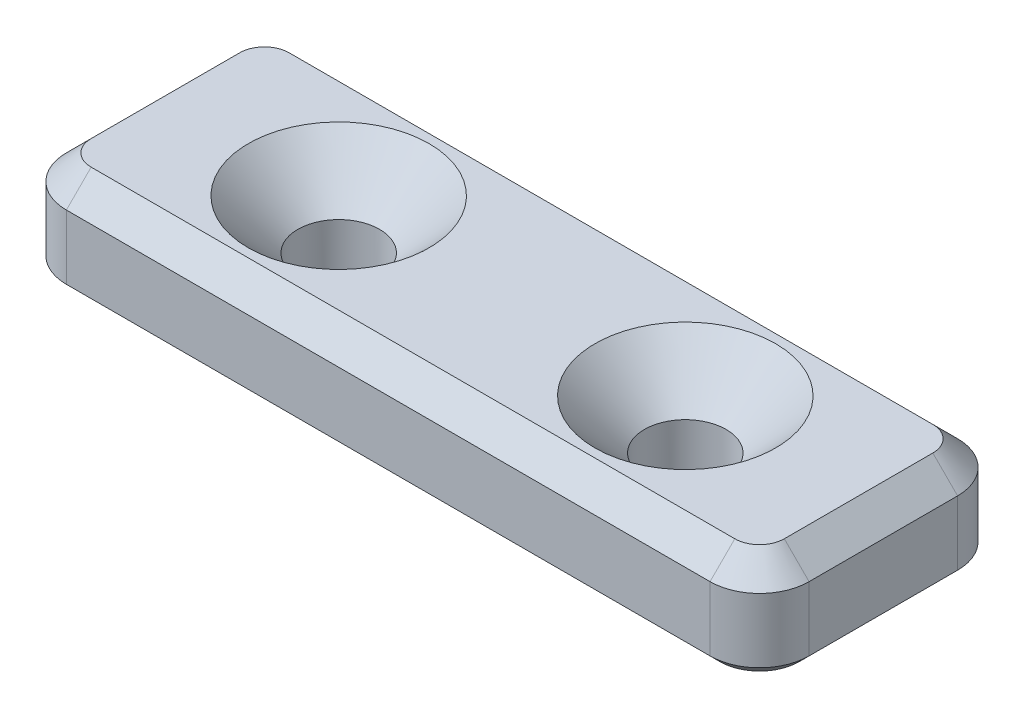
ISO-10303-21;
HEADER;
FILE_DESCRIPTION(('STEP AP214'),'2;1');
FILE_NAME('part.step','',(''),(''),'','','');
FILE_SCHEMA(('AUTOMOTIVE_DESIGN { 1 0 10303 214 1 1 1 1 }'));
ENDSEC;
DATA;
#1=APPLICATION_CONTEXT('core data for automotive mechanical design processes');
#2=APPLICATION_PROTOCOL_DEFINITION('international standard','automotive_design',2000,#1);
#3=PRODUCT_CONTEXT('',#1,'mechanical');
#4=PRODUCT('Part','Part','',(#3));
#5=PRODUCT_RELATED_PRODUCT_CATEGORY('part','',(#4));
#6=PRODUCT_DEFINITION_FORMATION('','',#4);
#7=PRODUCT_DEFINITION_CONTEXT('part definition',#1,'design');
#8=PRODUCT_DEFINITION('design','',#6,#7);
#9=PRODUCT_DEFINITION_SHAPE('','',#8);
#10=(LENGTH_UNIT() NAMED_UNIT(*) SI_UNIT(.MILLI.,.METRE.));
#11=(NAMED_UNIT(*) PLANE_ANGLE_UNIT() SI_UNIT($,.RADIAN.));
#12=(NAMED_UNIT(*) SI_UNIT($,.STERADIAN.) SOLID_ANGLE_UNIT());
#13=UNCERTAINTY_MEASURE_WITH_UNIT(LENGTH_MEASURE(1.E-05),#10,'distance_accuracy_value','');
#14=(GEOMETRIC_REPRESENTATION_CONTEXT(3) GLOBAL_UNCERTAINTY_ASSIGNED_CONTEXT((#13)) GLOBAL_UNIT_ASSIGNED_CONTEXT((#10,
#11,#12)) REPRESENTATION_CONTEXT('',''));
#15=CARTESIAN_POINT('',(0.,0.,0.));
#16=DIRECTION('',(0.,0.,1.));
#17=DIRECTION('',(1.,0.,0.));
#18=AXIS2_PLACEMENT_3D('',#15,#16,#17);
#19=CARTESIAN_POINT('',(0.,4.,0.));
#20=DIRECTION('',(1.,0.,0.));
#21=DIRECTION('',(0.,0.,-1.));
#22=AXIS2_PLACEMENT_3D('',#19,#20,#21);
#23=PLANE('',#22);
#24=DIRECTION('',(0.,-1.,0.));
#25=VECTOR('',#24,1.);
#26=CARTESIAN_POINT('',(0.,4.,-2.));
#27=LINE('',#26,#25);
#28=CARTESIAN_POINT('',(0.,0.399999999999994,-2.));
#29=VERTEX_POINT('',#28);
#30=CARTESIAN_POINT('',(0.,3.,-2.));
#31=VERTEX_POINT('',#30);
#32=EDGE_CURVE('E192',#29,#31,#27,.F.);
#33=ORIENTED_EDGE('',*,*,#32,.T.);
#34=DIRECTION('',(0.,0.,-1.));
#35=VECTOR('',#34,1.);
#36=CARTESIAN_POINT('',(0.,3.,0.));
#37=LINE('',#36,#35);
#38=CARTESIAN_POINT('',(0.,3.,-8.));
#39=VERTEX_POINT('',#38);
#40=EDGE_CURVE('E275',#31,#39,#37,.T.);
#41=ORIENTED_EDGE('',*,*,#40,.T.);
#42=DIRECTION('',(0.,-1.,0.));
#43=VECTOR('',#42,1.);
#44=CARTESIAN_POINT('',(0.,4.,-8.));
#45=LINE('',#44,#43);
#46=CARTESIAN_POINT('',(0.,0.399999999999994,-8.));
#47=VERTEX_POINT('',#46);
#48=EDGE_CURVE('E197',#39,#47,#45,.T.);
#49=ORIENTED_EDGE('',*,*,#48,.T.);
#50=DIRECTION('',(0.,0.,1.));
#51=VECTOR('',#50,1.);
#52=CARTESIAN_POINT('',(0.,0.399999999999994,-2.));
#53=LINE('',#52,#51);
#54=EDGE_CURVE('E223',#47,#29,#53,.T.);
#55=ORIENTED_EDGE('',*,*,#54,.T.);
#56=EDGE_LOOP('',(#33,#41,#49,#55));
#57=FACE_BOUND('',#56,.T.);
#58=ADVANCED_FACE('F43',(#57),#23,.F.);
#59=CARTESIAN_POINT('',(0.,4.,0.));
#60=DIRECTION('',(0.,0.,-1.));
#61=DIRECTION('',(-1.,0.,0.));
#62=AXIS2_PLACEMENT_3D('',#59,#60,#61);
#63=PLANE('',#62);
#64=DIRECTION('',(0.,-1.,0.));
#65=VECTOR('',#64,1.);
#66=CARTESIAN_POINT('',(28.,4.,0.));
#67=LINE('',#66,#65);
#68=CARTESIAN_POINT('',(28.,0.399999999999994,0.));
#69=VERTEX_POINT('',#68);
#70=CARTESIAN_POINT('',(28.,3.,0.));
#71=VERTEX_POINT('',#70);
#72=EDGE_CURVE('E186',#69,#71,#67,.F.);
#73=ORIENTED_EDGE('',*,*,#72,.T.);
#74=DIRECTION('',(-1.,0.,0.));
#75=VECTOR('',#74,1.);
#76=CARTESIAN_POINT('',(0.,3.,0.));
#77=LINE('',#76,#75);
#78=CARTESIAN_POINT('',(2.,3.,0.));
#79=VERTEX_POINT('',#78);
#80=EDGE_CURVE('E268',#71,#79,#77,.T.);
#81=ORIENTED_EDGE('',*,*,#80,.T.);
#82=DIRECTION('',(0.,-1.,0.));
#83=VECTOR('',#82,1.);
#84=CARTESIAN_POINT('',(2.,4.,0.));
#85=LINE('',#84,#83);
#86=CARTESIAN_POINT('',(2.,0.399999999999994,0.));
#87=VERTEX_POINT('',#86);
#88=EDGE_CURVE('E189',#79,#87,#85,.T.);
#89=ORIENTED_EDGE('',*,*,#88,.T.);
#90=DIRECTION('',(1.,0.,0.));
#91=VECTOR('',#90,1.);
#92=CARTESIAN_POINT('',(28.,0.399999999999994,0.));
#93=LINE('',#92,#91);
#94=EDGE_CURVE('E163',#87,#69,#93,.T.);
#95=ORIENTED_EDGE('',*,*,#94,.T.);
#96=EDGE_LOOP('',(#73,#81,#89,#95));
#97=FACE_BOUND('',#96,.T.);
#98=ADVANCED_FACE('F184',(#97),#63,.F.);
#99=CARTESIAN_POINT('',(30.,4.,0.));
#100=DIRECTION('',(-1.,0.,0.));
#101=DIRECTION('',(0.,0.,1.));
#102=AXIS2_PLACEMENT_3D('',#99,#100,#101);
#103=PLANE('',#102);
#104=DIRECTION('',(0.,-1.,0.));
#105=VECTOR('',#104,1.);
#106=CARTESIAN_POINT('',(30.,4.,-8.));
#107=LINE('',#106,#105);
#108=CARTESIAN_POINT('',(30.,0.399999999999994,-8.));
#109=VERTEX_POINT('',#108);
#110=CARTESIAN_POINT('',(30.,3.,-8.));
#111=VERTEX_POINT('',#110);
#112=EDGE_CURVE('E200',#109,#111,#107,.F.);
#113=ORIENTED_EDGE('',*,*,#112,.T.);
#114=DIRECTION('',(0.,0.,1.));
#115=VECTOR('',#114,1.);
#116=CARTESIAN_POINT('',(30.,3.,0.));
#117=LINE('',#116,#115);
#118=CARTESIAN_POINT('',(30.,3.,-2.));
#119=VERTEX_POINT('',#118);
#120=EDGE_CURVE('E273',#111,#119,#117,.T.);
#121=ORIENTED_EDGE('',*,*,#120,.T.);
#122=DIRECTION('',(0.,-1.,0.));
#123=VECTOR('',#122,1.);
#124=CARTESIAN_POINT('',(30.,4.,-2.));
#125=LINE('',#124,#123);
#126=CARTESIAN_POINT('',(30.,0.399999999999994,-2.));
#127=VERTEX_POINT('',#126);
#128=EDGE_CURVE('E320',#119,#127,#125,.T.);
#129=ORIENTED_EDGE('',*,*,#128,.T.);
#130=DIRECTION('',(0.,0.,-1.));
#131=VECTOR('',#130,1.);
#132=CARTESIAN_POINT('',(30.,0.399999999999994,-8.));
#133=LINE('',#132,#131);
#134=EDGE_CURVE('E221',#127,#109,#133,.T.);
#135=ORIENTED_EDGE('',*,*,#134,.T.);
#136=EDGE_LOOP('',(#113,#121,#129,#135));
#137=FACE_BOUND('',#136,.T.);
#138=ADVANCED_FACE('F319',(#137),#103,.F.);
#139=CARTESIAN_POINT('',(0.,4.,-10.));
#140=DIRECTION('',(0.,0.,1.));
#141=DIRECTION('',(1.,0.,0.));
#142=AXIS2_PLACEMENT_3D('',#139,#140,#141);
#143=PLANE('',#142);
#144=DIRECTION('',(0.,-1.,0.));
#145=VECTOR('',#144,1.);
#146=CARTESIAN_POINT('',(2.,4.,-10.));
#147=LINE('',#146,#145);
#148=CARTESIAN_POINT('',(2.,0.399999999999994,-10.));
#149=VERTEX_POINT('',#148);
#150=CARTESIAN_POINT('',(2.,3.,-10.));
#151=VERTEX_POINT('',#150);
#152=EDGE_CURVE('E324',#149,#151,#147,.F.);
#153=ORIENTED_EDGE('',*,*,#152,.T.);
#154=DIRECTION('',(1.,0.,0.));
#155=VECTOR('',#154,1.);
#156=CARTESIAN_POINT('',(0.,3.,-10.));
#157=LINE('',#156,#155);
#158=CARTESIAN_POINT('',(28.,3.,-10.));
#159=VERTEX_POINT('',#158);
#160=EDGE_CURVE('E11',#151,#159,#157,.T.);
#161=ORIENTED_EDGE('',*,*,#160,.T.);
#162=DIRECTION('',(0.,-1.,0.));
#163=VECTOR('',#162,1.);
#164=CARTESIAN_POINT('',(28.,4.,-10.));
#165=LINE('',#164,#163);
#166=CARTESIAN_POINT('',(28.,0.399999999999994,-10.));
#167=VERTEX_POINT('',#166);
#168=EDGE_CURVE('E317',#159,#167,#165,.T.);
#169=ORIENTED_EDGE('',*,*,#168,.T.);
#170=DIRECTION('',(-1.,0.,0.));
#171=VECTOR('',#170,1.);
#172=CARTESIAN_POINT('',(2.,0.399999999999994,-10.));
#173=LINE('',#172,#171);
#174=EDGE_CURVE('E231',#167,#149,#173,.T.);
#175=ORIENTED_EDGE('',*,*,#174,.T.);
#176=EDGE_LOOP('',(#153,#161,#169,#175));
#177=FACE_BOUND('',#176,.T.);
#178=ADVANCED_FACE('F522',(#177),#143,.F.);
#179=CARTESIAN_POINT('',(0.,4.,0.));
#180=DIRECTION('',(0.,-1.,0.));
#181=DIRECTION('',(0.,0.,-1.));
#182=AXIS2_PLACEMENT_3D('',#179,#180,#181);
#183=PLANE('',#182);
#184=CARTESIAN_POINT('',(2.,4.,-2.));
#185=DIRECTION('',(0.,-1.,0.));
#186=DIRECTION('',(0.,0.,-1.));
#187=AXIS2_PLACEMENT_3D('',#184,#185,#186);
#188=CIRCLE('',#187,0.999999999999999);
#189=CARTESIAN_POINT('',(1.,4.,-2.));
#190=VERTEX_POINT('',#189);
#191=CARTESIAN_POINT('',(2.,4.,-1.));
#192=VERTEX_POINT('',#191);
#193=EDGE_CURVE('E261',#190,#192,#188,.F.);
#194=ORIENTED_EDGE('',*,*,#193,.T.);
#195=DIRECTION('',(1.,0.,0.));
#196=VECTOR('',#195,1.);
#197=CARTESIAN_POINT('',(0.,4.,-1.));
#198=LINE('',#197,#196);
#199=CARTESIAN_POINT('',(28.,4.,-0.999999999999999));
#200=VERTEX_POINT('',#199);
#201=EDGE_CURVE('E265',#192,#200,#198,.T.);
#202=ORIENTED_EDGE('',*,*,#201,.T.);
#203=CARTESIAN_POINT('',(28.,4.,-2.));
#204=DIRECTION('',(0.,-1.,0.));
#205=DIRECTION('',(0.,0.,-1.));
#206=AXIS2_PLACEMENT_3D('',#203,#204,#205);
#207=CIRCLE('',#206,1.);
#208=CARTESIAN_POINT('',(29.,4.,-2.));
#209=VERTEX_POINT('',#208);
#210=EDGE_CURVE('E263',#200,#209,#207,.F.);
#211=ORIENTED_EDGE('',*,*,#210,.T.);
#212=DIRECTION('',(0.,0.,-1.));
#213=VECTOR('',#212,1.);
#214=CARTESIAN_POINT('',(29.,4.,0.));
#215=LINE('',#214,#213);
#216=CARTESIAN_POINT('',(29.,4.,-8.));
#217=VERTEX_POINT('',#216);
#218=EDGE_CURVE('E259',#209,#217,#215,.T.);
#219=ORIENTED_EDGE('',*,*,#218,.T.);
#220=CARTESIAN_POINT('',(28.,4.,-8.));
#221=DIRECTION('',(0.,-1.,0.));
#222=DIRECTION('',(0.,0.,-1.));
#223=AXIS2_PLACEMENT_3D('',#220,#221,#222);
#224=CIRCLE('',#223,0.999999999999999);
#225=CARTESIAN_POINT('',(28.,4.,-9.));
#226=VERTEX_POINT('',#225);
#227=EDGE_CURVE('E255',#217,#226,#224,.F.);
#228=ORIENTED_EDGE('',*,*,#227,.T.);
#229=DIRECTION('',(-1.,0.,0.));
#230=VECTOR('',#229,1.);
#231=CARTESIAN_POINT('',(0.,4.,-9.));
#232=LINE('',#231,#230);
#233=CARTESIAN_POINT('',(2.,4.,-9.));
#234=VERTEX_POINT('',#233);
#235=EDGE_CURVE('E232',#226,#234,#232,.T.);
#236=ORIENTED_EDGE('',*,*,#235,.T.);
#237=CARTESIAN_POINT('',(2.,4.,-8.));
#238=DIRECTION('',(0.,-1.,0.));
#239=DIRECTION('',(0.,0.,-1.));
#240=AXIS2_PLACEMENT_3D('',#237,#238,#239);
#241=CIRCLE('',#240,0.999999999999999);
#242=CARTESIAN_POINT('',(1.,4.,-8.));
#243=VERTEX_POINT('',#242);
#244=EDGE_CURVE('E253',#234,#243,#241,.F.);
#245=ORIENTED_EDGE('',*,*,#244,.T.);
#246=DIRECTION('',(0.,0.,1.));
#247=VECTOR('',#246,1.);
#248=CARTESIAN_POINT('',(1.,4.,0.));
#249=LINE('',#248,#247);
#250=EDGE_CURVE('E257',#243,#190,#249,.T.);
#251=ORIENTED_EDGE('',*,*,#250,.T.);
#252=EDGE_LOOP('',(#194,#202,#211,#219,#228,#236,#245,#251));
#253=FACE_BOUND('',#252,.T.);
#254=CARTESIAN_POINT('',(22.,4.,-5.));
#255=DIRECTION('',(0.,-1.,0.));
#256=DIRECTION('',(0.,0.,-1.));
#257=AXIS2_PLACEMENT_3D('',#254,#255,#256);
#258=CIRCLE('',#257,3.65);
#259=CARTESIAN_POINT('',(22.,4.,-8.65));
#260=VERTEX_POINT('',#259);
#261=EDGE_CURVE('E329',#260,#260,#258,.T.);
#262=ORIENTED_EDGE('',*,*,#261,.T.);
#263=EDGE_LOOP('',(#262));
#264=FACE_BOUND('',#263,.T.);
#265=CARTESIAN_POINT('',(8.,4.,-5.));
#266=DIRECTION('',(0.,-1.,0.));
#267=DIRECTION('',(0.,0.,-1.));
#268=AXIS2_PLACEMENT_3D('',#265,#266,#267);
#269=CIRCLE('',#268,3.65);
#270=CARTESIAN_POINT('',(8.,4.,-8.65000000000001));
#271=VERTEX_POINT('',#270);
#272=EDGE_CURVE('E332',#271,#271,#269,.T.);
#273=ORIENTED_EDGE('',*,*,#272,.T.);
#274=EDGE_LOOP('',(#273));
#275=FACE_BOUND('',#274,.T.);
#276=ADVANCED_FACE('F518',(#253,#264,#275),#183,.F.);
#277=CARTESIAN_POINT('',(0.,0.,0.));
#278=DIRECTION('',(0.,-1.,0.));
#279=DIRECTION('',(0.,0.,-1.));
#280=AXIS2_PLACEMENT_3D('',#277,#278,#279);
#281=PLANE('',#280);
#282=CARTESIAN_POINT('',(28.,0.,-2.));
#283=DIRECTION('',(0.,-1.,0.));
#284=DIRECTION('',(0.,0.,-1.));
#285=AXIS2_PLACEMENT_3D('',#282,#283,#284);
#286=CIRCLE('',#285,1.6);
#287=CARTESIAN_POINT('',(29.6,0.,-2.));
#288=VERTEX_POINT('',#287);
#289=CARTESIAN_POINT('',(28.,0.,-0.399999999999996));
#290=VERTEX_POINT('',#289);
#291=EDGE_CURVE('E217',#288,#290,#286,.T.);
#292=ORIENTED_EDGE('',*,*,#291,.T.);
#293=DIRECTION('',(-1.,0.,0.));
#294=VECTOR('',#293,1.);
#295=CARTESIAN_POINT('',(2.,0.,-0.399999999999998));
#296=LINE('',#295,#294);
#297=CARTESIAN_POINT('',(2.,0.,-0.399999999999998));
#298=VERTEX_POINT('',#297);
#299=EDGE_CURVE('E165',#290,#298,#296,.T.);
#300=ORIENTED_EDGE('',*,*,#299,.T.);
#301=CARTESIAN_POINT('',(2.,0.,-2.));
#302=DIRECTION('',(0.,-1.,0.));
#303=DIRECTION('',(0.,0.,-1.));
#304=AXIS2_PLACEMENT_3D('',#301,#302,#303);
#305=CIRCLE('',#304,1.6);
#306=CARTESIAN_POINT('',(0.399999999999998,0.,-2.));
#307=VERTEX_POINT('',#306);
#308=EDGE_CURVE('E215',#298,#307,#305,.T.);
#309=ORIENTED_EDGE('',*,*,#308,.T.);
#310=DIRECTION('',(0.,0.,-1.));
#311=VECTOR('',#310,1.);
#312=CARTESIAN_POINT('',(0.399999999999998,0.,-8.));
#313=LINE('',#312,#311);
#314=CARTESIAN_POINT('',(0.399999999999998,0.,-8.));
#315=VERTEX_POINT('',#314);
#316=EDGE_CURVE('E211',#307,#315,#313,.T.);
#317=ORIENTED_EDGE('',*,*,#316,.T.);
#318=CARTESIAN_POINT('',(2.,0.,-8.));
#319=DIRECTION('',(0.,-1.,0.));
#320=DIRECTION('',(0.,0.,-1.));
#321=AXIS2_PLACEMENT_3D('',#318,#319,#320);
#322=CIRCLE('',#321,1.6);
#323=CARTESIAN_POINT('',(2.,0.,-9.6));
#324=VERTEX_POINT('',#323);
#325=EDGE_CURVE('E207',#315,#324,#322,.T.);
#326=ORIENTED_EDGE('',*,*,#325,.T.);
#327=DIRECTION('',(1.,0.,0.));
#328=VECTOR('',#327,1.);
#329=CARTESIAN_POINT('',(28.,0.,-9.6));
#330=LINE('',#329,#328);
#331=CARTESIAN_POINT('',(28.,0.,-9.6));
#332=VERTEX_POINT('',#331);
#333=EDGE_CURVE('E191',#324,#332,#330,.T.);
#334=ORIENTED_EDGE('',*,*,#333,.T.);
#335=CARTESIAN_POINT('',(28.,0.,-8.));
#336=DIRECTION('',(0.,-1.,0.));
#337=DIRECTION('',(0.,0.,-1.));
#338=AXIS2_PLACEMENT_3D('',#335,#336,#337);
#339=CIRCLE('',#338,1.6);
#340=CARTESIAN_POINT('',(29.6,0.,-8.));
#341=VERTEX_POINT('',#340);
#342=EDGE_CURVE('E209',#332,#341,#339,.T.);
#343=ORIENTED_EDGE('',*,*,#342,.T.);
#344=DIRECTION('',(0.,0.,1.));
#345=VECTOR('',#344,1.);
#346=CARTESIAN_POINT('',(29.6,0.,-2.));
#347=LINE('',#346,#345);
#348=EDGE_CURVE('E213',#341,#288,#347,.T.);
#349=ORIENTED_EDGE('',*,*,#348,.T.);
#350=EDGE_LOOP('',(#292,#300,#309,#317,#326,#334,#343,#349));
#351=FACE_BOUND('',#350,.T.);
#352=CARTESIAN_POINT('',(8.,0.,-5.));
#353=DIRECTION('',(0.,1.,0.));
#354=DIRECTION('',(0.,0.,1.));
#355=AXIS2_PLACEMENT_3D('',#352,#353,#354);
#356=CIRCLE('',#355,1.65);
#357=CARTESIAN_POINT('',(8.,0.,-3.35));
#358=VERTEX_POINT('',#357);
#359=EDGE_CURVE('E338',#358,#358,#356,.T.);
#360=ORIENTED_EDGE('',*,*,#359,.T.);
#361=EDGE_LOOP('',(#360));
#362=FACE_BOUND('',#361,.T.);
#363=CARTESIAN_POINT('',(22.,0.,-5.));
#364=DIRECTION('',(0.,1.,0.));
#365=DIRECTION('',(0.,0.,1.));
#366=AXIS2_PLACEMENT_3D('',#363,#364,#365);
#367=CIRCLE('',#366,1.65);
#368=CARTESIAN_POINT('',(22.,0.,-3.35));
#369=VERTEX_POINT('',#368);
#370=EDGE_CURVE('E251',#369,#369,#367,.T.);
#371=ORIENTED_EDGE('',*,*,#370,.T.);
#372=EDGE_LOOP('',(#371));
#373=FACE_BOUND('',#372,.T.);
#374=ADVANCED_FACE('F344',(#351,#362,#373),#281,.T.);
#375=CARTESIAN_POINT('',(22.,0.,-5.));
#376=DIRECTION('',(0.,1.,0.));
#377=DIRECTION('',(0.,0.,1.));
#378=AXIS2_PLACEMENT_3D('',#375,#376,#377);
#379=CYLINDRICAL_SURFACE('',#378,1.65);
#380=CARTESIAN_POINT('',(22.,2.,-5.));
#381=DIRECTION('',(0.,-1.,0.));
#382=DIRECTION('',(0.,0.,-1.));
#383=AXIS2_PLACEMENT_3D('',#380,#381,#382);
#384=CIRCLE('',#383,1.65);
#385=CARTESIAN_POINT('',(22.,2.,-6.65));
#386=VERTEX_POINT('',#385);
#387=EDGE_CURVE('E335',#386,#386,#384,.F.);
#388=ORIENTED_EDGE('',*,*,#387,.T.);
#389=EDGE_LOOP('',(#388));
#390=FACE_BOUND('',#389,.T.);
#391=ORIENTED_EDGE('',*,*,#370,.F.);
#392=EDGE_LOOP('',(#391));
#393=FACE_BOUND('',#392,.T.);
#394=ADVANCED_FACE('F350',(#390,#393),#379,.F.);
#395=CARTESIAN_POINT('',(8.,0.,-5.));
#396=DIRECTION('',(0.,1.,0.));
#397=DIRECTION('',(0.,0.,1.));
#398=AXIS2_PLACEMENT_3D('',#395,#396,#397);
#399=CYLINDRICAL_SURFACE('',#398,1.65);
#400=CARTESIAN_POINT('',(8.,2.,-5.));
#401=DIRECTION('',(0.,-1.,0.));
#402=DIRECTION('',(0.,0.,-1.));
#403=AXIS2_PLACEMENT_3D('',#400,#401,#402);
#404=CIRCLE('',#403,1.65);
#405=CARTESIAN_POINT('',(8.,2.,-6.65));
#406=VERTEX_POINT('',#405);
#407=EDGE_CURVE('E326',#406,#406,#404,.F.);
#408=ORIENTED_EDGE('',*,*,#407,.T.);
#409=EDGE_LOOP('',(#408));
#410=FACE_BOUND('',#409,.T.);
#411=ORIENTED_EDGE('',*,*,#359,.F.);
#412=EDGE_LOOP('',(#411));
#413=FACE_BOUND('',#412,.T.);
#414=ADVANCED_FACE('F347',(#410,#413),#399,.F.);
#415=CARTESIAN_POINT('',(22.,2.,-5.));
#416=DIRECTION('',(0.,1.,0.));
#417=DIRECTION('',(0.,0.,1.));
#418=AXIS2_PLACEMENT_3D('',#415,#416,#417);
#419=CONICAL_SURFACE('',#418,1.65,0.78539816339745);
#420=ORIENTED_EDGE('',*,*,#261,.F.);
#421=EDGE_LOOP('',(#420));
#422=FACE_BOUND('',#421,.T.);
#423=ORIENTED_EDGE('',*,*,#387,.F.);
#424=EDGE_LOOP('',(#423));
#425=FACE_BOUND('',#424,.T.);
#426=ADVANCED_FACE('F349',(#422,#425),#419,.F.);
#427=CARTESIAN_POINT('',(8.,2.,-5.));
#428=DIRECTION('',(0.,1.,0.));
#429=DIRECTION('',(0.,0.,1.));
#430=AXIS2_PLACEMENT_3D('',#427,#428,#429);
#431=CONICAL_SURFACE('',#430,1.65,0.78539816339745);
#432=ORIENTED_EDGE('',*,*,#272,.F.);
#433=EDGE_LOOP('',(#432));
#434=FACE_BOUND('',#433,.T.);
#435=ORIENTED_EDGE('',*,*,#407,.F.);
#436=EDGE_LOOP('',(#435));
#437=FACE_BOUND('',#436,.T.);
#438=ADVANCED_FACE('F357',(#434,#437),#431,.F.);
#439=CARTESIAN_POINT('',(28.,4.,-8.));
#440=DIRECTION('',(0.,-1.,0.));
#441=DIRECTION('',(0.,0.,-1.));
#442=AXIS2_PLACEMENT_3D('',#439,#440,#441);
#443=CYLINDRICAL_SURFACE('',#442,2.);
#444=ORIENTED_EDGE('',*,*,#168,.F.);
#445=CARTESIAN_POINT('',(28.,3.,-8.));
#446=DIRECTION('',(0.,-1.,0.));
#447=DIRECTION('',(0.,0.,-1.));
#448=AXIS2_PLACEMENT_3D('',#445,#446,#447);
#449=CIRCLE('',#448,2.);
#450=EDGE_CURVE('E277',#159,#111,#449,.T.);
#451=ORIENTED_EDGE('',*,*,#450,.T.);
#452=ORIENTED_EDGE('',*,*,#112,.F.);
#453=CARTESIAN_POINT('',(28.,0.399999999999994,-8.));
#454=DIRECTION('',(0.,-1.,0.));
#455=DIRECTION('',(0.,0.,-1.));
#456=AXIS2_PLACEMENT_3D('',#453,#454,#455);
#457=CIRCLE('',#456,2.);
#458=EDGE_CURVE('E225',#109,#167,#457,.F.);
#459=ORIENTED_EDGE('',*,*,#458,.T.);
#460=EDGE_LOOP('',(#444,#451,#452,#459));
#461=FACE_BOUND('',#460,.T.);
#462=ADVANCED_FACE('F315',(#461),#443,.T.);
#463=CARTESIAN_POINT('',(28.,4.,-2.));
#464=DIRECTION('',(0.,-1.,0.));
#465=DIRECTION('',(0.,0.,-1.));
#466=AXIS2_PLACEMENT_3D('',#463,#464,#465);
#467=CYLINDRICAL_SURFACE('',#466,2.);
#468=ORIENTED_EDGE('',*,*,#128,.F.);
#469=CARTESIAN_POINT('',(28.,3.,-2.));
#470=DIRECTION('',(0.,-1.,0.));
#471=DIRECTION('',(0.,0.,-1.));
#472=AXIS2_PLACEMENT_3D('',#469,#470,#471);
#473=CIRCLE('',#472,2.);
#474=EDGE_CURVE('E196',#119,#71,#473,.T.);
#475=ORIENTED_EDGE('',*,*,#474,.T.);
#476=ORIENTED_EDGE('',*,*,#72,.F.);
#477=CARTESIAN_POINT('',(28.,0.399999999999994,-2.));
#478=DIRECTION('',(0.,-1.,0.));
#479=DIRECTION('',(0.,0.,-1.));
#480=AXIS2_PLACEMENT_3D('',#477,#478,#479);
#481=CIRCLE('',#480,2.);
#482=EDGE_CURVE('E172',#69,#127,#481,.F.);
#483=ORIENTED_EDGE('',*,*,#482,.T.);
#484=EDGE_LOOP('',(#468,#475,#476,#483));
#485=FACE_BOUND('',#484,.T.);
#486=ADVANCED_FACE('F194',(#485),#467,.T.);
#487=CARTESIAN_POINT('',(2.,4.,-2.));
#488=DIRECTION('',(0.,-1.,0.));
#489=DIRECTION('',(0.,0.,-1.));
#490=AXIS2_PLACEMENT_3D('',#487,#488,#489);
#491=CYLINDRICAL_SURFACE('',#490,2.);
#492=ORIENTED_EDGE('',*,*,#88,.F.);
#493=CARTESIAN_POINT('',(2.,3.,-2.));
#494=DIRECTION('',(0.,-1.,0.));
#495=DIRECTION('',(0.,0.,-1.));
#496=AXIS2_PLACEMENT_3D('',#493,#494,#495);
#497=CIRCLE('',#496,2.);
#498=EDGE_CURVE('E271',#79,#31,#497,.T.);
#499=ORIENTED_EDGE('',*,*,#498,.T.);
#500=ORIENTED_EDGE('',*,*,#32,.F.);
#501=CARTESIAN_POINT('',(2.,0.399999999999994,-2.));
#502=DIRECTION('',(0.,-1.,0.));
#503=DIRECTION('',(0.,0.,-1.));
#504=AXIS2_PLACEMENT_3D('',#501,#502,#503);
#505=CIRCLE('',#504,2.);
#506=EDGE_CURVE('E180',#29,#87,#505,.F.);
#507=ORIENTED_EDGE('',*,*,#506,.T.);
#508=EDGE_LOOP('',(#492,#499,#500,#507));
#509=FACE_BOUND('',#508,.T.);
#510=ADVANCED_FACE('F386',(#509),#491,.T.);
#511=CARTESIAN_POINT('',(2.,4.,-8.));
#512=DIRECTION('',(0.,-1.,0.));
#513=DIRECTION('',(0.,0.,-1.));
#514=AXIS2_PLACEMENT_3D('',#511,#512,#513);
#515=CYLINDRICAL_SURFACE('',#514,2.);
#516=ORIENTED_EDGE('',*,*,#48,.F.);
#517=CARTESIAN_POINT('',(2.,3.,-8.));
#518=DIRECTION('',(0.,-1.,0.));
#519=DIRECTION('',(0.,0.,-1.));
#520=AXIS2_PLACEMENT_3D('',#517,#518,#519);
#521=CIRCLE('',#520,2.);
#522=EDGE_CURVE('E53',#39,#151,#521,.T.);
#523=ORIENTED_EDGE('',*,*,#522,.T.);
#524=ORIENTED_EDGE('',*,*,#152,.F.);
#525=CARTESIAN_POINT('',(2.,0.399999999999994,-8.));
#526=DIRECTION('',(0.,-1.,0.));
#527=DIRECTION('',(0.,0.,-1.));
#528=AXIS2_PLACEMENT_3D('',#525,#526,#527);
#529=CIRCLE('',#528,2.);
#530=EDGE_CURVE('E228',#149,#47,#529,.F.);
#531=ORIENTED_EDGE('',*,*,#530,.T.);
#532=EDGE_LOOP('',(#516,#523,#524,#531));
#533=FACE_BOUND('',#532,.T.);
#534=ADVANCED_FACE('F389',(#533),#515,.T.);
#535=CARTESIAN_POINT('',(0.,0.399999999999994,-10.));
#536=DIRECTION('',(0.,-0.707106781186551,-0.707106781186544));
#537=DIRECTION('',(1.,0.,0.));
#538=AXIS2_PLACEMENT_3D('',#535,#536,#537);
#539=PLANE('',#538);
#540=DIRECTION('',(0.,0.707106781186544,-0.707106781186551));
#541=VECTOR('',#540,1.);
#542=CARTESIAN_POINT('',(28.,0.,-9.6));
#543=LINE('',#542,#541);
#544=EDGE_CURVE('E245',#332,#167,#543,.T.);
#545=ORIENTED_EDGE('',*,*,#544,.F.);
#546=ORIENTED_EDGE('',*,*,#333,.F.);
#547=DIRECTION('',(0.,-0.707106781186544,0.707106781186551));
#548=VECTOR('',#547,1.);
#549=CARTESIAN_POINT('',(2.,0.399999999999994,-10.));
#550=LINE('',#549,#548);
#551=EDGE_CURVE('E248',#149,#324,#550,.T.);
#552=ORIENTED_EDGE('',*,*,#551,.F.);
#553=ORIENTED_EDGE('',*,*,#174,.F.);
#554=EDGE_LOOP('',(#545,#546,#552,#553));
#555=FACE_BOUND('',#554,.T.);
#556=ADVANCED_FACE('F393',(#555),#539,.T.);
#557=CARTESIAN_POINT('',(2.,0.,-8.));
#558=DIRECTION('',(0.,1.,0.));
#559=DIRECTION('',(0.,0.,1.));
#560=AXIS2_PLACEMENT_3D('',#557,#558,#559);
#561=CONICAL_SURFACE('',#560,1.6,0.785398163397453);
#562=ORIENTED_EDGE('',*,*,#551,.T.);
#563=ORIENTED_EDGE('',*,*,#325,.F.);
#564=DIRECTION('',(0.707106781186551,-0.707106781186544,0.));
#565=VECTOR('',#564,1.);
#566=CARTESIAN_POINT('',(0.,0.399999999999994,-8.));
#567=LINE('',#566,#565);
#568=EDGE_CURVE('E242',#47,#315,#567,.T.);
#569=ORIENTED_EDGE('',*,*,#568,.F.);
#570=ORIENTED_EDGE('',*,*,#530,.F.);
#571=EDGE_LOOP('',(#562,#563,#569,#570));
#572=FACE_BOUND('',#571,.T.);
#573=ADVANCED_FACE('F431',(#572),#561,.T.);
#574=CARTESIAN_POINT('',(28.,0.,-8.));
#575=DIRECTION('',(0.,1.,0.));
#576=DIRECTION('',(0.,0.,1.));
#577=AXIS2_PLACEMENT_3D('',#574,#575,#576);
#578=CONICAL_SURFACE('',#577,1.6,0.785398163397453);
#579=ORIENTED_EDGE('',*,*,#544,.T.);
#580=ORIENTED_EDGE('',*,*,#458,.F.);
#581=DIRECTION('',(0.707106781186554,0.707106781186541,0.));
#582=VECTOR('',#581,1.);
#583=CARTESIAN_POINT('',(29.6,0.,-8.));
#584=LINE('',#583,#582);
#585=EDGE_CURVE('E239',#341,#109,#584,.T.);
#586=ORIENTED_EDGE('',*,*,#585,.F.);
#587=ORIENTED_EDGE('',*,*,#342,.F.);
#588=EDGE_LOOP('',(#579,#580,#586,#587));
#589=FACE_BOUND('',#588,.T.);
#590=ADVANCED_FACE('F424',(#589),#578,.T.);
#591=CARTESIAN_POINT('',(0.,0.399999999999994,0.));
#592=DIRECTION('',(-0.707106781186544,-0.707106781186551,0.));
#593=DIRECTION('',(0.,0.,-1.));
#594=AXIS2_PLACEMENT_3D('',#591,#592,#593);
#595=PLANE('',#594);
#596=ORIENTED_EDGE('',*,*,#568,.T.);
#597=ORIENTED_EDGE('',*,*,#316,.F.);
#598=DIRECTION('',(0.707106781186551,-0.707106781186544,0.));
#599=VECTOR('',#598,1.);
#600=CARTESIAN_POINT('',(0.,0.399999999999994,-2.));
#601=LINE('',#600,#599);
#602=EDGE_CURVE('E236',#29,#307,#601,.T.);
#603=ORIENTED_EDGE('',*,*,#602,.F.);
#604=ORIENTED_EDGE('',*,*,#54,.F.);
#605=EDGE_LOOP('',(#596,#597,#603,#604));
#606=FACE_BOUND('',#605,.T.);
#607=ADVANCED_FACE('F417',(#606),#595,.T.);
#608=CARTESIAN_POINT('',(30.,0.399999999999994,0.));
#609=DIRECTION('',(0.707106781186544,-0.707106781186551,0.));
#610=DIRECTION('',(0.,0.,1.));
#611=AXIS2_PLACEMENT_3D('',#608,#609,#610);
#612=PLANE('',#611);
#613=ORIENTED_EDGE('',*,*,#585,.T.);
#614=ORIENTED_EDGE('',*,*,#134,.F.);
#615=DIRECTION('',(0.707106781186551,0.707106781186544,0.));
#616=VECTOR('',#615,1.);
#617=CARTESIAN_POINT('',(29.6,0.,-2.));
#618=LINE('',#617,#616);
#619=EDGE_CURVE('E175',#288,#127,#618,.T.);
#620=ORIENTED_EDGE('',*,*,#619,.F.);
#621=ORIENTED_EDGE('',*,*,#348,.F.);
#622=EDGE_LOOP('',(#613,#614,#620,#621));
#623=FACE_BOUND('',#622,.T.);
#624=ADVANCED_FACE('F410',(#623),#612,.T.);
#625=CARTESIAN_POINT('',(2.,0.,-2.));
#626=DIRECTION('',(0.,1.,0.));
#627=DIRECTION('',(0.,0.,1.));
#628=AXIS2_PLACEMENT_3D('',#625,#626,#627);
#629=CONICAL_SURFACE('',#628,1.6,0.785398163397453);
#630=ORIENTED_EDGE('',*,*,#602,.T.);
#631=ORIENTED_EDGE('',*,*,#308,.F.);
#632=DIRECTION('',(0.,-0.707106781186544,-0.707106781186551));
#633=VECTOR('',#632,1.);
#634=CARTESIAN_POINT('',(2.,0.399999999999994,0.));
#635=LINE('',#634,#633);
#636=EDGE_CURVE('E168',#87,#298,#635,.T.);
#637=ORIENTED_EDGE('',*,*,#636,.F.);
#638=ORIENTED_EDGE('',*,*,#506,.F.);
#639=EDGE_LOOP('',(#630,#631,#637,#638));
#640=FACE_BOUND('',#639,.T.);
#641=ADVANCED_FACE('F404',(#640),#629,.T.);
#642=CARTESIAN_POINT('',(28.,0.,-2.));
#643=DIRECTION('',(0.,1.,0.));
#644=DIRECTION('',(0.,0.,1.));
#645=AXIS2_PLACEMENT_3D('',#642,#643,#644);
#646=CONICAL_SURFACE('',#645,1.6,0.78539816339745);
#647=ORIENTED_EDGE('',*,*,#619,.T.);
#648=ORIENTED_EDGE('',*,*,#482,.F.);
#649=DIRECTION('',(0.,0.707106781186546,0.707106781186549));
#650=VECTOR('',#649,1.);
#651=CARTESIAN_POINT('',(28.,0.,-0.399999999999996));
#652=LINE('',#651,#650);
#653=EDGE_CURVE('E159',#290,#69,#652,.T.);
#654=ORIENTED_EDGE('',*,*,#653,.F.);
#655=ORIENTED_EDGE('',*,*,#291,.F.);
#656=EDGE_LOOP('',(#647,#648,#654,#655));
#657=FACE_BOUND('',#656,.T.);
#658=ADVANCED_FACE('F173',(#657),#646,.T.);
#659=CARTESIAN_POINT('',(0.,0.399999999999994,0.));
#660=DIRECTION('',(0.,-0.707106781186551,0.707106781186544));
#661=DIRECTION('',(-1.,0.,0.));
#662=AXIS2_PLACEMENT_3D('',#659,#660,#661);
#663=PLANE('',#662);
#664=ORIENTED_EDGE('',*,*,#636,.T.);
#665=ORIENTED_EDGE('',*,*,#299,.F.);
#666=ORIENTED_EDGE('',*,*,#653,.T.);
#667=ORIENTED_EDGE('',*,*,#94,.F.);
#668=EDGE_LOOP('',(#664,#665,#666,#667));
#669=FACE_BOUND('',#668,.T.);
#670=ADVANCED_FACE('F161',(#669),#663,.T.);
#671=CARTESIAN_POINT('',(0.,4.,-9.));
#672=DIRECTION('',(0.,-0.707106781186547,0.707106781186547));
#673=DIRECTION('',(-1.,0.,0.));
#674=AXIS2_PLACEMENT_3D('',#671,#672,#673);
#675=PLANE('',#674);
#676=DIRECTION('',(0.,0.707106781186547,0.707106781186547));
#677=VECTOR('',#676,1.);
#678=CARTESIAN_POINT('',(28.,3.,-10.));
#679=LINE('',#678,#677);
#680=EDGE_CURVE('E295',#159,#226,#679,.T.);
#681=ORIENTED_EDGE('',*,*,#680,.F.);
#682=ORIENTED_EDGE('',*,*,#160,.F.);
#683=DIRECTION('',(0.,-0.707106781186547,-0.707106781186547));
#684=VECTOR('',#683,1.);
#685=CARTESIAN_POINT('',(2.,4.,-9.));
#686=LINE('',#685,#684);
#687=EDGE_CURVE('E48',#234,#151,#686,.T.);
#688=ORIENTED_EDGE('',*,*,#687,.F.);
#689=ORIENTED_EDGE('',*,*,#235,.F.);
#690=EDGE_LOOP('',(#681,#682,#688,#689));
#691=FACE_BOUND('',#690,.T.);
#692=ADVANCED_FACE('F46',(#691),#675,.F.);
#693=CARTESIAN_POINT('',(2.,4.,-8.));
#694=DIRECTION('',(0.,-1.,0.));
#695=DIRECTION('',(0.,0.,-1.));
#696=AXIS2_PLACEMENT_3D('',#693,#694,#695);
#697=CONICAL_SURFACE('',#696,0.999999999999999,0.785398163397448);
#698=ORIENTED_EDGE('',*,*,#687,.T.);
#699=ORIENTED_EDGE('',*,*,#522,.F.);
#700=DIRECTION('',(-0.707106781186547,-0.707106781186547,0.));
#701=VECTOR('',#700,1.);
#702=CARTESIAN_POINT('',(1.,4.,-8.));
#703=LINE('',#702,#701);
#704=EDGE_CURVE('E293',#243,#39,#703,.T.);
#705=ORIENTED_EDGE('',*,*,#704,.F.);
#706=ORIENTED_EDGE('',*,*,#244,.F.);
#707=EDGE_LOOP('',(#698,#699,#705,#706));
#708=FACE_BOUND('',#707,.T.);
#709=ADVANCED_FACE('F305',(#708),#697,.T.);
#710=CARTESIAN_POINT('',(28.,4.,-8.));
#711=DIRECTION('',(0.,-1.,0.));
#712=DIRECTION('',(0.,0.,-1.));
#713=AXIS2_PLACEMENT_3D('',#710,#711,#712);
#714=CONICAL_SURFACE('',#713,0.999999999999999,0.785398163397448);
#715=ORIENTED_EDGE('',*,*,#680,.T.);
#716=ORIENTED_EDGE('',*,*,#227,.F.);
#717=DIRECTION('',(-0.707106781186547,0.707106781186547,0.));
#718=VECTOR('',#717,1.);
#719=CARTESIAN_POINT('',(30.,3.,-8.));
#720=LINE('',#719,#718);
#721=EDGE_CURVE('E290',#111,#217,#720,.T.);
#722=ORIENTED_EDGE('',*,*,#721,.F.);
#723=ORIENTED_EDGE('',*,*,#450,.F.);
#724=EDGE_LOOP('',(#715,#716,#722,#723));
#725=FACE_BOUND('',#724,.T.);
#726=ADVANCED_FACE('F310',(#725),#714,.T.);
#727=CARTESIAN_POINT('',(1.,4.,0.));
#728=DIRECTION('',(0.707106781186547,-0.707106781186547,0.));
#729=DIRECTION('',(0.,0.,1.));
#730=AXIS2_PLACEMENT_3D('',#727,#728,#729);
#731=PLANE('',#730);
#732=ORIENTED_EDGE('',*,*,#704,.T.);
#733=ORIENTED_EDGE('',*,*,#40,.F.);
#734=DIRECTION('',(-0.707106781186547,-0.707106781186547,0.));
#735=VECTOR('',#734,1.);
#736=CARTESIAN_POINT('',(1.,4.,-2.));
#737=LINE('',#736,#735);
#738=EDGE_CURVE('E287',#190,#31,#737,.T.);
#739=ORIENTED_EDGE('',*,*,#738,.F.);
#740=ORIENTED_EDGE('',*,*,#250,.F.);
#741=EDGE_LOOP('',(#732,#733,#739,#740));
#742=FACE_BOUND('',#741,.T.);
#743=ADVANCED_FACE('F471',(#742),#731,.F.);
#744=CARTESIAN_POINT('',(29.,4.,0.));
#745=DIRECTION('',(-0.707106781186547,-0.707106781186547,0.));
#746=DIRECTION('',(0.,0.,-1.));
#747=AXIS2_PLACEMENT_3D('',#744,#745,#746);
#748=PLANE('',#747);
#749=ORIENTED_EDGE('',*,*,#721,.T.);
#750=ORIENTED_EDGE('',*,*,#218,.F.);
#751=DIRECTION('',(-0.707106781186547,0.707106781186547,0.));
#752=VECTOR('',#751,1.);
#753=CARTESIAN_POINT('',(30.,3.,-2.));
#754=LINE('',#753,#752);
#755=EDGE_CURVE('E284',#119,#209,#754,.T.);
#756=ORIENTED_EDGE('',*,*,#755,.F.);
#757=ORIENTED_EDGE('',*,*,#120,.F.);
#758=EDGE_LOOP('',(#749,#750,#756,#757));
#759=FACE_BOUND('',#758,.T.);
#760=ADVANCED_FACE('F464',(#759),#748,.F.);
#761=CARTESIAN_POINT('',(2.,4.,-2.));
#762=DIRECTION('',(0.,-1.,0.));
#763=DIRECTION('',(0.,0.,-1.));
#764=AXIS2_PLACEMENT_3D('',#761,#762,#763);
#765=CONICAL_SURFACE('',#764,0.999999999999999,0.785398163397448);
#766=ORIENTED_EDGE('',*,*,#738,.T.);
#767=ORIENTED_EDGE('',*,*,#498,.F.);
#768=DIRECTION('',(0.,-0.707106781186547,0.707106781186547));
#769=VECTOR('',#768,1.);
#770=CARTESIAN_POINT('',(2.,4.,-1.));
#771=LINE('',#770,#769);
#772=EDGE_CURVE('E282',#192,#79,#771,.T.);
#773=ORIENTED_EDGE('',*,*,#772,.F.);
#774=ORIENTED_EDGE('',*,*,#193,.F.);
#775=EDGE_LOOP('',(#766,#767,#773,#774));
#776=FACE_BOUND('',#775,.T.);
#777=ADVANCED_FACE('F457',(#776),#765,.T.);
#778=CARTESIAN_POINT('',(28.,4.,-2.));
#779=DIRECTION('',(0.,-1.,0.));
#780=DIRECTION('',(0.,0.,-1.));
#781=AXIS2_PLACEMENT_3D('',#778,#779,#780);
#782=CONICAL_SURFACE('',#781,1.,0.785398163397447);
#783=ORIENTED_EDGE('',*,*,#755,.T.);
#784=ORIENTED_EDGE('',*,*,#210,.F.);
#785=DIRECTION('',(0.,0.707106781186548,-0.707106781186547));
#786=VECTOR('',#785,1.);
#787=CARTESIAN_POINT('',(28.,3.,0.));
#788=LINE('',#787,#786);
#789=EDGE_CURVE('E280',#71,#200,#788,.T.);
#790=ORIENTED_EDGE('',*,*,#789,.F.);
#791=ORIENTED_EDGE('',*,*,#474,.F.);
#792=EDGE_LOOP('',(#783,#784,#790,#791));
#793=FACE_BOUND('',#792,.T.);
#794=ADVANCED_FACE('F450',(#793),#782,.T.);
#795=CARTESIAN_POINT('',(0.,4.,-1.));
#796=DIRECTION('',(0.,-0.707106781186547,-0.707106781186547));
#797=DIRECTION('',(1.,0.,0.));
#798=AXIS2_PLACEMENT_3D('',#795,#796,#797);
#799=PLANE('',#798);
#800=ORIENTED_EDGE('',*,*,#772,.T.);
#801=ORIENTED_EDGE('',*,*,#80,.F.);
#802=ORIENTED_EDGE('',*,*,#789,.T.);
#803=ORIENTED_EDGE('',*,*,#201,.F.);
#804=EDGE_LOOP('',(#800,#801,#802,#803));
#805=FACE_BOUND('',#804,.T.);
#806=ADVANCED_FACE('F444',(#805),#799,.F.);
#807=CLOSED_SHELL('',(#58,#98,#138,#178,#276,#374,#394,#414,#426,#438,#462,#486,#510,#534,#556,
#573,#590,#607,#624,#641,#658,#670,#692,#709,#726,#743,#760,#777,#794,#806));
#808=MANIFOLD_SOLID_BREP('B2',#807);
#809=ADVANCED_BREP_SHAPE_REPRESENTATION('',(#18,#808),#14);
#810=SHAPE_DEFINITION_REPRESENTATION(#9,#809);
ENDSEC;
END-ISO-10303-21;
